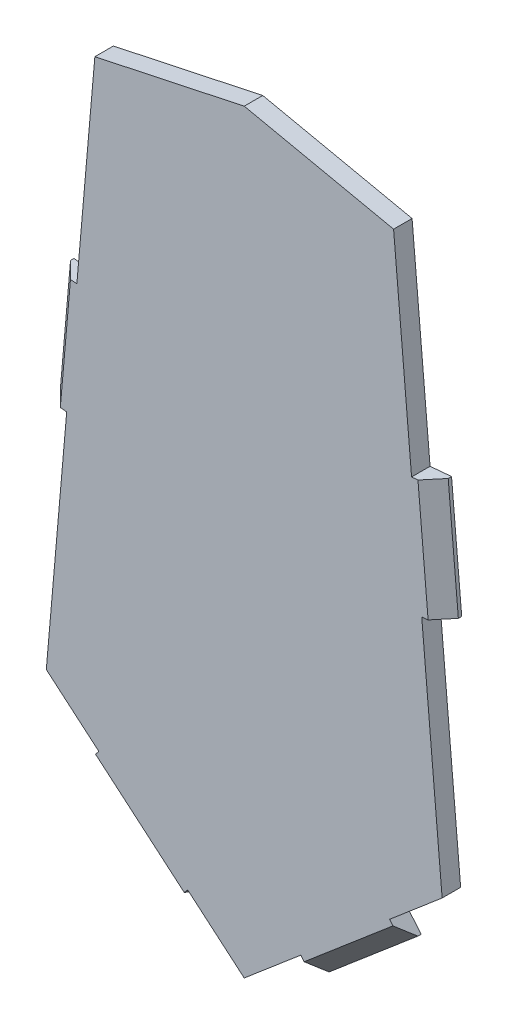
ISO-10303-21;
HEADER;
FILE_DESCRIPTION(('STEP AP214'),'2;1');
FILE_NAME('part.step','',(''),(''),'','','');
FILE_SCHEMA(('AUTOMOTIVE_DESIGN { 1 0 10303 214 1 1 1 1 }'));
ENDSEC;
DATA;
#1=APPLICATION_CONTEXT('core data for automotive mechanical design processes');
#2=APPLICATION_PROTOCOL_DEFINITION('international standard','automotive_design',2000,#1);
#3=PRODUCT_CONTEXT('',#1,'mechanical');
#4=PRODUCT('Part','Part','',(#3));
#5=PRODUCT_RELATED_PRODUCT_CATEGORY('part','',(#4));
#6=PRODUCT_DEFINITION_FORMATION('','',#4);
#7=PRODUCT_DEFINITION_CONTEXT('part definition',#1,'design');
#8=PRODUCT_DEFINITION('design','',#6,#7);
#9=PRODUCT_DEFINITION_SHAPE('','',#8);
#10=(LENGTH_UNIT() NAMED_UNIT(*) SI_UNIT(.MILLI.,.METRE.));
#11=(NAMED_UNIT(*) PLANE_ANGLE_UNIT() SI_UNIT($,.RADIAN.));
#12=(NAMED_UNIT(*) SI_UNIT($,.STERADIAN.) SOLID_ANGLE_UNIT());
#13=UNCERTAINTY_MEASURE_WITH_UNIT(LENGTH_MEASURE(1.E-05),#10,'distance_accuracy_value','');
#14=(GEOMETRIC_REPRESENTATION_CONTEXT(3) GLOBAL_UNCERTAINTY_ASSIGNED_CONTEXT((#13)) GLOBAL_UNIT_ASSIGNED_CONTEXT((#10,
#11,#12)) REPRESENTATION_CONTEXT('',''));
#15=CARTESIAN_POINT('',(0.,0.,0.));
#16=DIRECTION('',(0.,0.,1.));
#17=DIRECTION('',(1.,0.,0.));
#18=AXIS2_PLACEMENT_3D('',#15,#16,#17);
#19=CARTESIAN_POINT('',(30.5992695588796,2.67708919857576,3.175));
#20=DIRECTION('',(-0.996194698091746,-0.0871557427476548,0.));
#21=DIRECTION('',(0.0871557427476548,-0.996194698091746,0.));
#22=AXIS2_PLACEMENT_3D('',#19,#20,#21);
#23=PLANE('',#22);
#24=DIRECTION('',(-0.0871557427476548,0.996194698091746,0.));
#25=VECTOR('',#24,1.);
#26=CARTESIAN_POINT('',(30.5992695588796,2.67708919857576,0.));
#27=LINE('',#26,#25);
#28=CARTESIAN_POINT('',(33.9676308380893,-35.8234563973893,0.));
#29=VERTEX_POINT('',#28);
#30=CARTESIAN_POINT('',(30.4648415370611,4.21360851891802,0.));
#31=VERTEX_POINT('',#30);
#32=EDGE_CURVE('E249',#29,#31,#27,.T.);
#33=ORIENTED_EDGE('',*,*,#32,.T.);
#34=DIRECTION('',(0.,0.,-1.));
#35=VECTOR('',#34,1.);
#36=CARTESIAN_POINT('',(30.4648415370611,4.21360851891802,3.175));
#37=LINE('',#36,#35);
#38=CARTESIAN_POINT('',(30.4648415370611,4.21360851891802,3.175));
#39=VERTEX_POINT('',#38);
#40=EDGE_CURVE('E227',#39,#31,#37,.T.);
#41=ORIENTED_EDGE('',*,*,#40,.F.);
#42=DIRECTION('',(-0.0871557427476548,0.996194698091746,0.));
#43=VECTOR('',#42,1.);
#44=CARTESIAN_POINT('',(30.5992695588796,2.67708919857576,3.175));
#45=LINE('',#44,#43);
#46=CARTESIAN_POINT('',(33.9676308380893,-35.8234563973893,3.175));
#47=VERTEX_POINT('',#46);
#48=EDGE_CURVE('E234',#47,#39,#45,.T.);
#49=ORIENTED_EDGE('',*,*,#48,.F.);
#50=DIRECTION('',(0.,0.,-1.));
#51=VECTOR('',#50,1.);
#52=CARTESIAN_POINT('',(33.9676308380893,-35.8234563973893,3.175));
#53=LINE('',#52,#51);
#54=EDGE_CURVE('E343',#47,#29,#53,.T.);
#55=ORIENTED_EDGE('',*,*,#54,.T.);
#56=EDGE_LOOP('',(#33,#41,#49,#55));
#57=FACE_BOUND('',#56,.T.);
#58=ADVANCED_FACE('F49',(#57),#23,.F.);
#59=CARTESIAN_POINT('',(-0.1344280218185,1.53651932034224,3.175));
#60=DIRECTION('',(0.0871557427476553,-0.996194698091746,0.));
#61=DIRECTION('',(0.996194698091746,0.0871557427476553,0.));
#62=AXIS2_PLACEMENT_3D('',#59,#60,#61);
#63=PLANE('',#62);
#64=DIRECTION('',(0.,0.,-1.));
#65=VECTOR('',#64,1.);
#66=CARTESIAN_POINT('',(34.1507619200005,4.53608476708434,3.175));
#67=LINE('',#66,#65);
#68=CARTESIAN_POINT('',(34.1507619200005,4.53608476708434,0.57500000000001));
#69=VERTEX_POINT('',#68);
#70=CARTESIAN_POINT('',(34.1507619200005,4.53608476708434,0.));
#71=VERTEX_POINT('',#70);
#72=EDGE_CURVE('E253',#69,#71,#67,.T.);
#73=ORIENTED_EDGE('',*,*,#72,.F.);
#74=DIRECTION('',(0.70441602640276,0.0616284167162174,-0.707106781186546));
#75=VECTOR('',#74,1.);
#76=CARTESIAN_POINT('',(15.7131138415717,2.92299957814134,19.0830768987698));
#77=LINE('',#76,#75);
#78=CARTESIAN_POINT('',(31.560655704962,4.30947983594044,3.175));
#79=VERTEX_POINT('',#78);
#80=EDGE_CURVE('E229',#69,#79,#77,.F.);
#81=ORIENTED_EDGE('',*,*,#80,.T.);
#82=DIRECTION('',(-0.996194698091746,-0.0871557427476553,0.));
#83=VECTOR('',#82,1.);
#84=CARTESIAN_POINT('',(-0.1344280218185,1.53651932034224,3.175));
#85=LINE('',#84,#83);
#86=EDGE_CURVE('E221',#79,#39,#85,.T.);
#87=ORIENTED_EDGE('',*,*,#86,.T.);
#88=ORIENTED_EDGE('',*,*,#40,.T.);
#89=DIRECTION('',(-0.996194698091746,-0.0871557427476553,0.));
#90=VECTOR('',#89,1.);
#91=CARTESIAN_POINT('',(-0.1344280218185,1.53651932034224,0.));
#92=LINE('',#91,#90);
#93=EDGE_CURVE('E416',#71,#31,#92,.T.);
#94=ORIENTED_EDGE('',*,*,#93,.F.);
#95=EDGE_LOOP('',(#73,#81,#87,#88,#94));
#96=FACE_BOUND('',#95,.T.);
#97=ADVANCED_FACE('F224',(#96),#63,.T.);
#98=CARTESIAN_POINT('',(34.285189941819,2.99956544674209,3.175));
#99=DIRECTION('',(0.996194698091746,0.0871557427476549,0.));
#100=DIRECTION('',(-0.0871557427476549,0.996194698091746,0.));
#101=AXIS2_PLACEMENT_3D('',#98,#99,#100);
#102=PLANE('',#101);
#103=DIRECTION('',(0.,0.,-1.));
#104=VECTOR('',#103,1.);
#105=CARTESIAN_POINT('',(32.4076470650474,24.4599787289193,3.175));
#106=LINE('',#105,#104);
#107=CARTESIAN_POINT('',(32.4076470650474,24.4599787289193,0.57500000000001));
#108=VERTEX_POINT('',#107);
#109=CARTESIAN_POINT('',(32.4076470650474,24.4599787289193,0.));
#110=VERTEX_POINT('',#109);
#111=EDGE_CURVE('E260',#108,#110,#106,.T.);
#112=ORIENTED_EDGE('',*,*,#111,.F.);
#113=DIRECTION('',(0.0871557427476549,-0.996194698091746,0.));
#114=VECTOR('',#113,1.);
#115=CARTESIAN_POINT('',(34.285189941819,2.99956544674209,0.57500000000001));
#116=LINE('',#115,#114);
#117=EDGE_CURVE('E283',#108,#69,#116,.T.);
#118=ORIENTED_EDGE('',*,*,#117,.T.);
#119=ORIENTED_EDGE('',*,*,#72,.T.);
#120=DIRECTION('',(0.0871557427476549,-0.996194698091746,0.));
#121=VECTOR('',#120,1.);
#122=CARTESIAN_POINT('',(34.285189941819,2.99956544674209,0.));
#123=LINE('',#122,#121);
#124=EDGE_CURVE('E412',#110,#71,#123,.T.);
#125=ORIENTED_EDGE('',*,*,#124,.F.);
#126=EDGE_LOOP('',(#112,#118,#119,#125));
#127=FACE_BOUND('',#126,.T.);
#128=ADVANCED_FACE('F413',(#127),#102,.T.);
#129=CARTESIAN_POINT('',(-1.8775428767716,21.4604132821772,3.175));
#130=DIRECTION('',(-0.0871557427476548,0.996194698091746,0.));
#131=DIRECTION('',(-0.996194698091746,-0.0871557427476548,0.));
#132=AXIS2_PLACEMENT_3D('',#129,#130,#131);
#133=PLANE('',#132);
#134=DIRECTION('',(0.996194698091746,0.0871557427476548,0.));
#135=VECTOR('',#134,1.);
#136=CARTESIAN_POINT('',(-1.8775428767716,21.4604132821772,3.175));
#137=LINE('',#136,#135);
#138=CARTESIAN_POINT('',(28.721726682108,24.1375024807529,3.175));
#139=VERTEX_POINT('',#138);
#140=CARTESIAN_POINT('',(29.8175408500089,24.2333737977754,3.175));
#141=VERTEX_POINT('',#140);
#142=EDGE_CURVE('E233',#139,#141,#137,.T.);
#143=ORIENTED_EDGE('',*,*,#142,.T.);
#144=DIRECTION('',(-0.70441602640276,-0.0616284167162171,0.707106781186546));
#145=VECTOR('',#144,1.);
#146=CARTESIAN_POINT('',(13.9699989866186,22.8468935399763,19.0830768987698));
#147=LINE('',#146,#145);
#148=EDGE_CURVE('E289',#141,#108,#147,.F.);
#149=ORIENTED_EDGE('',*,*,#148,.T.);
#150=ORIENTED_EDGE('',*,*,#111,.T.);
#151=DIRECTION('',(0.996194698091746,0.0871557427476548,0.));
#152=VECTOR('',#151,1.);
#153=CARTESIAN_POINT('',(-1.8775428767716,21.4604132821772,0.));
#154=LINE('',#153,#152);
#155=CARTESIAN_POINT('',(28.721726682108,24.1375024807529,0.));
#156=VERTEX_POINT('',#155);
#157=EDGE_CURVE('E407',#156,#110,#154,.T.);
#158=ORIENTED_EDGE('',*,*,#157,.F.);
#159=DIRECTION('',(0.,0.,-1.));
#160=VECTOR('',#159,1.);
#161=CARTESIAN_POINT('',(28.721726682108,24.1375024807529,3.175));
#162=LINE('',#161,#160);
#163=EDGE_CURVE('E397',#139,#156,#162,.T.);
#164=ORIENTED_EDGE('',*,*,#163,.F.);
#165=EDGE_LOOP('',(#143,#149,#150,#158,#164));
#166=FACE_BOUND('',#165,.T.);
#167=ADVANCED_FACE('F405',(#166),#133,.T.);
#168=CARTESIAN_POINT('',(25.6343918200051,59.4259014307288,0.));
#169=VERTEX_POINT('',#168);
#170=EDGE_CURVE('E421',#156,#169,#27,.T.);
#171=ORIENTED_EDGE('',*,*,#170,.T.);
#172=DIRECTION('',(0.,0.,-1.));
#173=VECTOR('',#172,1.);
#174=CARTESIAN_POINT('',(25.6343918200051,59.4259014307288,3.175));
#175=LINE('',#174,#173);
#176=CARTESIAN_POINT('',(25.6343918200051,59.4259014307288,3.175));
#177=VERTEX_POINT('',#176);
#178=EDGE_CURVE('E393',#177,#169,#175,.T.);
#179=ORIENTED_EDGE('',*,*,#178,.F.);
#180=EDGE_CURVE('E247',#139,#177,#45,.T.);
#181=ORIENTED_EDGE('',*,*,#180,.F.);
#182=ORIENTED_EDGE('',*,*,#163,.T.);
#183=EDGE_LOOP('',(#171,#179,#181,#182));
#184=FACE_BOUND('',#183,.T.);
#185=ADVANCED_FACE('F528',(#184),#23,.F.);
#186=CARTESIAN_POINT('',(13.2273349663387,62.0698933577639,3.175));
#187=DIRECTION('',(-0.208423819180372,-0.978038604349679,0.));
#188=DIRECTION('',(0.978038604349679,-0.208423819180372,0.));
#189=AXIS2_PLACEMENT_3D('',#186,#187,#188);
#190=PLANE('',#189);
#191=DIRECTION('',(-0.978038604349679,0.208423819180372,0.));
#192=VECTOR('',#191,1.);
#193=CARTESIAN_POINT('',(13.2273349663387,62.0698933577639,0.));
#194=LINE('',#193,#192);
#195=CARTESIAN_POINT('',(0.,64.8886897314464,0.));
#196=VERTEX_POINT('',#195);
#197=EDGE_CURVE('E425',#169,#196,#194,.T.);
#198=ORIENTED_EDGE('',*,*,#197,.T.);
#199=DIRECTION('',(0.,0.,-1.));
#200=VECTOR('',#199,1.);
#201=CARTESIAN_POINT('',(0.,64.8886897314464,3.175));
#202=LINE('',#201,#200);
#203=CARTESIAN_POINT('',(0.,64.8886897314464,3.175));
#204=VERTEX_POINT('',#203);
#205=EDGE_CURVE('E389',#204,#196,#202,.T.);
#206=ORIENTED_EDGE('',*,*,#205,.F.);
#207=DIRECTION('',(-0.978038604349679,0.208423819180372,0.));
#208=VECTOR('',#207,1.);
#209=CARTESIAN_POINT('',(13.2273349663387,62.0698933577639,3.175));
#210=LINE('',#209,#208);
#211=EDGE_CURVE('E514',#177,#204,#210,.T.);
#212=ORIENTED_EDGE('',*,*,#211,.F.);
#213=ORIENTED_EDGE('',*,*,#178,.T.);
#214=EDGE_LOOP('',(#198,#206,#212,#213));
#215=FACE_BOUND('',#214,.T.);
#216=ADVANCED_FACE('F530',(#215),#190,.F.);
#217=CARTESIAN_POINT('',(-13.2273349663387,62.0698933577639,3.175));
#218=DIRECTION('',(0.208423819180372,-0.978038604349679,0.));
#219=DIRECTION('',(0.978038604349679,0.208423819180372,0.));
#220=AXIS2_PLACEMENT_3D('',#217,#218,#219);
#221=PLANE('',#220);
#222=DIRECTION('',(-0.978038604349679,-0.208423819180372,0.));
#223=VECTOR('',#222,1.);
#224=CARTESIAN_POINT('',(-13.2273349663387,62.0698933577639,0.));
#225=LINE('',#224,#223);
#226=CARTESIAN_POINT('',(-25.6343918200051,59.4259014307288,0.));
#227=VERTEX_POINT('',#226);
#228=EDGE_CURVE('E431',#196,#227,#225,.T.);
#229=ORIENTED_EDGE('',*,*,#228,.T.);
#230=DIRECTION('',(0.,0.,-1.));
#231=VECTOR('',#230,1.);
#232=CARTESIAN_POINT('',(-25.6343918200051,59.4259014307288,3.175));
#233=LINE('',#232,#231);
#234=CARTESIAN_POINT('',(-25.6343918200051,59.4259014307288,3.175));
#235=VERTEX_POINT('',#234);
#236=EDGE_CURVE('E385',#235,#227,#233,.T.);
#237=ORIENTED_EDGE('',*,*,#236,.F.);
#238=DIRECTION('',(-0.978038604349679,-0.208423819180372,0.));
#239=VECTOR('',#238,1.);
#240=CARTESIAN_POINT('',(-13.2273349663387,62.0698933577639,3.175));
#241=LINE('',#240,#239);
#242=EDGE_CURVE('E509',#204,#235,#241,.T.);
#243=ORIENTED_EDGE('',*,*,#242,.F.);
#244=ORIENTED_EDGE('',*,*,#205,.T.);
#245=EDGE_LOOP('',(#229,#237,#243,#244));
#246=FACE_BOUND('',#245,.T.);
#247=ADVANCED_FACE('F533',(#246),#221,.F.);
#248=CARTESIAN_POINT('',(-30.5992695588795,2.67708919857573,3.175));
#249=DIRECTION('',(0.996194698091746,-0.0871557427476539,0.));
#250=DIRECTION('',(0.0871557427476539,0.996194698091746,0.));
#251=AXIS2_PLACEMENT_3D('',#248,#249,#250);
#252=PLANE('',#251);
#253=DIRECTION('',(-0.0871557427476539,-0.996194698091746,0.));
#254=VECTOR('',#253,1.);
#255=CARTESIAN_POINT('',(-30.5992695588795,2.67708919857573,0.));
#256=LINE('',#255,#254);
#257=CARTESIAN_POINT('',(-28.7217266821079,24.1375024807529,0.));
#258=VERTEX_POINT('',#257);
#259=EDGE_CURVE('E434',#227,#258,#256,.T.);
#260=ORIENTED_EDGE('',*,*,#259,.T.);
#261=DIRECTION('',(0.,0.,-1.));
#262=VECTOR('',#261,1.);
#263=CARTESIAN_POINT('',(-28.7217266821079,24.1375024807529,3.175));
#264=LINE('',#263,#262);
#265=CARTESIAN_POINT('',(-28.7217266821079,24.1375024807529,3.175));
#266=VERTEX_POINT('',#265);
#267=EDGE_CURVE('E381',#266,#258,#264,.T.);
#268=ORIENTED_EDGE('',*,*,#267,.F.);
#269=DIRECTION('',(-0.0871557427476539,-0.996194698091746,0.));
#270=VECTOR('',#269,1.);
#271=CARTESIAN_POINT('',(-30.5992695588795,2.67708919857573,3.175));
#272=LINE('',#271,#270);
#273=EDGE_CURVE('E501',#235,#266,#272,.T.);
#274=ORIENTED_EDGE('',*,*,#273,.F.);
#275=ORIENTED_EDGE('',*,*,#236,.T.);
#276=EDGE_LOOP('',(#260,#268,#274,#275));
#277=FACE_BOUND('',#276,.T.);
#278=ADVANCED_FACE('F536',(#277),#252,.F.);
#279=CARTESIAN_POINT('',(1.87754287677156,21.4604132821772,3.175));
#280=DIRECTION('',(-0.087155742747653,-0.996194698091746,0.));
#281=DIRECTION('',(0.996194698091746,-0.087155742747653,0.));
#282=AXIS2_PLACEMENT_3D('',#279,#280,#281);
#283=PLANE('',#282);
#284=DIRECTION('',(0.,0.,-1.));
#285=VECTOR('',#284,1.);
#286=CARTESIAN_POINT('',(-32.4076470650474,24.4599787289193,3.175));
#287=LINE('',#286,#285);
#288=CARTESIAN_POINT('',(-32.4076470650474,24.4599787289193,0.575000000000022));
#289=VERTEX_POINT('',#288);
#290=CARTESIAN_POINT('',(-32.4076470650474,24.4599787289193,0.));
#291=VERTEX_POINT('',#290);
#292=EDGE_CURVE('E378',#289,#291,#287,.T.);
#293=ORIENTED_EDGE('',*,*,#292,.F.);
#294=DIRECTION('',(0.704416026402759,-0.0616284167162157,0.707106781186548));
#295=VECTOR('',#294,1.);
#296=CARTESIAN_POINT('',(-29.8175408500089,24.2333737977754,3.17499999999999));
#297=LINE('',#296,#295);
#298=CARTESIAN_POINT('',(-29.8175408500089,24.2333737977754,3.175));
#299=VERTEX_POINT('',#298);
#300=EDGE_CURVE('E280',#289,#299,#297,.T.);
#301=ORIENTED_EDGE('',*,*,#300,.T.);
#302=DIRECTION('',(-0.996194698091746,0.087155742747653,0.));
#303=VECTOR('',#302,1.);
#304=CARTESIAN_POINT('',(1.87754287677156,21.4604132821772,3.175));
#305=LINE('',#304,#303);
#306=EDGE_CURVE('E505',#266,#299,#305,.T.);
#307=ORIENTED_EDGE('',*,*,#306,.F.);
#308=ORIENTED_EDGE('',*,*,#267,.T.);
#309=DIRECTION('',(-0.996194698091746,0.087155742747653,0.));
#310=VECTOR('',#309,1.);
#311=CARTESIAN_POINT('',(1.87754287677156,21.4604132821772,0.));
#312=LINE('',#311,#310);
#313=EDGE_CURVE('E437',#258,#291,#312,.T.);
#314=ORIENTED_EDGE('',*,*,#313,.T.);
#315=EDGE_LOOP('',(#293,#301,#307,#308,#314));
#316=FACE_BOUND('',#315,.T.);
#317=ADVANCED_FACE('F541',(#316),#283,.F.);
#318=CARTESIAN_POINT('',(-34.285189941819,2.99956544674203,3.175));
#319=DIRECTION('',(0.996194698091746,-0.0871557427476535,0.));
#320=DIRECTION('',(0.0871557427476535,0.996194698091746,0.));
#321=AXIS2_PLACEMENT_3D('',#318,#319,#320);
#322=PLANE('',#321);
#323=DIRECTION('',(0.,0.,-1.));
#324=VECTOR('',#323,1.);
#325=CARTESIAN_POINT('',(-34.1507619200005,4.53608476708434,3.175));
#326=LINE('',#325,#324);
#327=CARTESIAN_POINT('',(-34.1507619200005,4.53608476708434,0.575000000000022));
#328=VERTEX_POINT('',#327);
#329=CARTESIAN_POINT('',(-34.1507619200005,4.53608476708434,0.));
#330=VERTEX_POINT('',#329);
#331=EDGE_CURVE('E375',#328,#330,#326,.T.);
#332=ORIENTED_EDGE('',*,*,#331,.F.);
#333=DIRECTION('',(0.0871557427476535,0.996194698091746,0.));
#334=VECTOR('',#333,1.);
#335=CARTESIAN_POINT('',(-32.4076470650474,24.4599787289193,0.575000000000022));
#336=LINE('',#335,#334);
#337=EDGE_CURVE('E277',#328,#289,#336,.T.);
#338=ORIENTED_EDGE('',*,*,#337,.T.);
#339=ORIENTED_EDGE('',*,*,#292,.T.);
#340=DIRECTION('',(-0.0871557427476535,-0.996194698091746,0.));
#341=VECTOR('',#340,1.);
#342=CARTESIAN_POINT('',(-34.285189941819,2.99956544674203,0.));
#343=LINE('',#342,#341);
#344=EDGE_CURVE('E442',#291,#330,#343,.T.);
#345=ORIENTED_EDGE('',*,*,#344,.T.);
#346=EDGE_LOOP('',(#332,#338,#339,#345));
#347=FACE_BOUND('',#346,.T.);
#348=ADVANCED_FACE('F553',(#347),#322,.F.);
#349=CARTESIAN_POINT('',(0.134428021818501,1.53651932034229,3.175));
#350=DIRECTION('',(0.087155742747654,0.996194698091746,0.));
#351=DIRECTION('',(-0.996194698091746,0.087155742747654,0.));
#352=AXIS2_PLACEMENT_3D('',#349,#350,#351);
#353=PLANE('',#352);
#354=DIRECTION('',(0.996194698091746,-0.087155742747654,0.));
#355=VECTOR('',#354,1.);
#356=CARTESIAN_POINT('',(0.134428021818501,1.53651932034229,3.175));
#357=LINE('',#356,#355);
#358=CARTESIAN_POINT('',(-31.560655704962,4.30947983594044,3.175));
#359=VERTEX_POINT('',#358);
#360=CARTESIAN_POINT('',(-30.464841537061,4.21360851891802,3.175));
#361=VERTEX_POINT('',#360);
#362=EDGE_CURVE('E499',#359,#361,#357,.T.);
#363=ORIENTED_EDGE('',*,*,#362,.F.);
#364=DIRECTION('',(-0.704416026402759,0.0616284167162164,-0.707106781186548));
#365=VECTOR('',#364,1.);
#366=CARTESIAN_POINT('',(-31.560655704962,4.30947983594044,3.175));
#367=LINE('',#366,#365);
#368=EDGE_CURVE('E274',#359,#328,#367,.T.);
#369=ORIENTED_EDGE('',*,*,#368,.T.);
#370=ORIENTED_EDGE('',*,*,#331,.T.);
#371=DIRECTION('',(0.996194698091746,-0.087155742747654,0.));
#372=VECTOR('',#371,1.);
#373=CARTESIAN_POINT('',(0.134428021818501,1.53651932034229,0.));
#374=LINE('',#373,#372);
#375=CARTESIAN_POINT('',(-30.464841537061,4.21360851891802,0.));
#376=VERTEX_POINT('',#375);
#377=EDGE_CURVE('E446',#330,#376,#374,.T.);
#378=ORIENTED_EDGE('',*,*,#377,.T.);
#379=DIRECTION('',(0.,0.,-1.));
#380=VECTOR('',#379,1.);
#381=CARTESIAN_POINT('',(-30.464841537061,4.21360851891802,3.175));
#382=LINE('',#381,#380);
#383=EDGE_CURVE('E371',#361,#376,#382,.T.);
#384=ORIENTED_EDGE('',*,*,#383,.F.);
#385=EDGE_LOOP('',(#363,#369,#370,#378,#384));
#386=FACE_BOUND('',#385,.T.);
#387=ADVANCED_FACE('F550',(#386),#353,.F.);
#388=CARTESIAN_POINT('',(-33.9676308380892,-35.8234563973893,0.));
#389=VERTEX_POINT('',#388);
#390=EDGE_CURVE('E438',#376,#389,#256,.T.);
#391=ORIENTED_EDGE('',*,*,#390,.T.);
#392=DIRECTION('',(0.,0.,-1.));
#393=VECTOR('',#392,1.);
#394=CARTESIAN_POINT('',(-33.9676308380892,-35.8234563973893,3.175));
#395=LINE('',#394,#393);
#396=CARTESIAN_POINT('',(-33.9676308380892,-35.8234563973893,3.175));
#397=VERTEX_POINT('',#396);
#398=EDGE_CURVE('E367',#397,#389,#395,.T.);
#399=ORIENTED_EDGE('',*,*,#398,.F.);
#400=EDGE_CURVE('E493',#361,#397,#272,.T.);
#401=ORIENTED_EDGE('',*,*,#400,.F.);
#402=ORIENTED_EDGE('',*,*,#383,.T.);
#403=EDGE_LOOP('',(#391,#399,#401,#402));
#404=FACE_BOUND('',#403,.T.);
#405=ADVANCED_FACE('F559',(#404),#252,.F.);
#406=CARTESIAN_POINT('',(-31.922317355983,-37.5616939272189,3.175));
#407=DIRECTION('',(0.647588089129566,0.761990594966577,0.));
#408=DIRECTION('',(-0.761990594966577,0.647588089129566,0.));
#409=AXIS2_PLACEMENT_3D('',#406,#407,#408);
#410=PLANE('',#409);
#411=DIRECTION('',(0.761990594966577,-0.647588089129566,0.));
#412=VECTOR('',#411,1.);
#413=CARTESIAN_POINT('',(-31.922317355983,-37.5616939272189,0.));
#414=LINE('',#413,#412);
#415=CARTESIAN_POINT('',(-24.9380422877353,-43.4973752535746,0.));
#416=VERTEX_POINT('',#415);
#417=EDGE_CURVE('E449',#389,#416,#414,.T.);
#418=ORIENTED_EDGE('',*,*,#417,.T.);
#419=DIRECTION('',(0.,0.,-1.));
#420=VECTOR('',#419,1.);
#421=CARTESIAN_POINT('',(-24.9380422877353,-43.4973752535746,3.175));
#422=LINE('',#421,#420);
#423=CARTESIAN_POINT('',(-24.9380422877353,-43.4973752535746,3.175));
#424=VERTEX_POINT('',#423);
#425=EDGE_CURVE('E363',#424,#416,#422,.T.);
#426=ORIENTED_EDGE('',*,*,#425,.F.);
#427=DIRECTION('',(0.761990594966577,-0.647588089129566,0.));
#428=VECTOR('',#427,1.);
#429=CARTESIAN_POINT('',(-31.922317355983,-37.5616939272189,3.175));
#430=LINE('',#429,#428);
#431=EDGE_CURVE('E485',#397,#424,#430,.T.);
#432=ORIENTED_EDGE('',*,*,#431,.F.);
#433=ORIENTED_EDGE('',*,*,#398,.T.);
#434=EDGE_LOOP('',(#418,#426,#432,#433));
#435=FACE_BOUND('',#434,.T.);
#436=ADVANCED_FACE('F561',(#435),#410,.F.);
#437=CARTESIAN_POINT('',(6.98427506824771,-5.93568132635574,3.175));
#438=DIRECTION('',(0.761990594966576,-0.647588089129567,0.));
#439=DIRECTION('',(0.647588089129567,0.761990594966576,0.));
#440=AXIS2_PLACEMENT_3D('',#437,#438,#439);
#441=PLANE('',#440);
#442=DIRECTION('',(0.,0.,-1.));
#443=VECTOR('',#442,1.);
#444=CARTESIAN_POINT('',(-27.2046005996888,-46.1643423359576,3.175));
#445=LINE('',#444,#443);
#446=CARTESIAN_POINT('',(-27.2046005996888,-46.1643423359576,0.574999999999994));
#447=VERTEX_POINT('',#446);
#448=CARTESIAN_POINT('',(-27.2046005996888,-46.1643423359576,0.));
#449=VERTEX_POINT('',#448);
#450=EDGE_CURVE('E360',#447,#449,#445,.T.);
#451=ORIENTED_EDGE('',*,*,#450,.F.);
#452=DIRECTION('',(0.457913929239153,0.538808716901236,0.70710678118655));
#453=VECTOR('',#452,1.);
#454=CARTESIAN_POINT('',(-25.5208715679519,-44.1831667890446,3.17499999999993));
#455=LINE('',#454,#453);
#456=CARTESIAN_POINT('',(-25.5208715679519,-44.1831667890445,3.175));
#457=VERTEX_POINT('',#456);
#458=EDGE_CURVE('E11',#447,#457,#455,.T.);
#459=ORIENTED_EDGE('',*,*,#458,.T.);
#460=DIRECTION('',(-0.647588089129567,-0.761990594966576,0.));
#461=VECTOR('',#460,1.);
#462=CARTESIAN_POINT('',(6.98427506824771,-5.93568132635574,3.175));
#463=LINE('',#462,#461);
#464=EDGE_CURVE('E489',#424,#457,#463,.T.);
#465=ORIENTED_EDGE('',*,*,#464,.F.);
#466=ORIENTED_EDGE('',*,*,#425,.T.);
#467=DIRECTION('',(-0.647588089129567,-0.761990594966576,0.));
#468=VECTOR('',#467,1.);
#469=CARTESIAN_POINT('',(6.98427506824771,-5.93568132635574,0.));
#470=LINE('',#469,#468);
#471=EDGE_CURVE('E452',#416,#449,#470,.T.);
#472=ORIENTED_EDGE('',*,*,#471,.T.);
#473=EDGE_LOOP('',(#451,#459,#465,#466,#472));
#474=FACE_BOUND('',#473,.T.);
#475=ADVANCED_FACE('F565',(#474),#441,.F.);
#476=CARTESIAN_POINT('',(-34.1888756679359,-40.2286610096025,3.175));
#477=DIRECTION('',(0.647588089129556,0.761990594966585,0.));
#478=DIRECTION('',(-0.761990594966585,0.647588089129556,0.));
#479=AXIS2_PLACEMENT_3D('',#476,#477,#478);
#480=PLANE('',#479);
#481=DIRECTION('',(0.,0.,-1.));
#482=VECTOR('',#481,1.);
#483=CARTESIAN_POINT('',(-11.964788700357,-59.1161041185487,3.175));
#484=LINE('',#483,#482);
#485=CARTESIAN_POINT('',(-11.964788700357,-59.1161041185487,0.574999999999994));
#486=VERTEX_POINT('',#485);
#487=CARTESIAN_POINT('',(-11.964788700357,-59.1161041185487,0.));
#488=VERTEX_POINT('',#487);
#489=EDGE_CURVE('E357',#486,#488,#484,.T.);
#490=ORIENTED_EDGE('',*,*,#489,.F.);
#491=DIRECTION('',(-0.761990594966585,0.647588089129556,0.));
#492=VECTOR('',#491,1.);
#493=CARTESIAN_POINT('',(-27.2046005996887,-46.1643423359576,0.574999999999994));
#494=LINE('',#493,#492);
#495=EDGE_CURVE('E59',#486,#447,#494,.T.);
#496=ORIENTED_EDGE('',*,*,#495,.T.);
#497=ORIENTED_EDGE('',*,*,#450,.T.);
#498=DIRECTION('',(0.761990594966585,-0.647588089129556,0.));
#499=VECTOR('',#498,1.);
#500=CARTESIAN_POINT('',(-34.1888756679359,-40.2286610096025,0.));
#501=LINE('',#500,#499);
#502=EDGE_CURVE('E457',#449,#488,#501,.T.);
#503=ORIENTED_EDGE('',*,*,#502,.T.);
#504=EDGE_LOOP('',(#490,#496,#497,#503));
#505=FACE_BOUND('',#504,.T.);
#506=ADVANCED_FACE('F652',(#505),#480,.F.);
#507=CARTESIAN_POINT('',(22.2240869675792,-18.887443108947,3.175));
#508=DIRECTION('',(-0.761990594966577,0.647588089129566,0.));
#509=DIRECTION('',(-0.647588089129566,-0.761990594966577,0.));
#510=AXIS2_PLACEMENT_3D('',#507,#508,#509);
#511=PLANE('',#510);
#512=DIRECTION('',(0.647588089129566,0.761990594966577,0.));
#513=VECTOR('',#512,1.);
#514=CARTESIAN_POINT('',(22.2240869675792,-18.887443108947,3.175));
#515=LINE('',#514,#513);
#516=CARTESIAN_POINT('',(-10.2810596686202,-57.1349285716356,3.175));
#517=VERTEX_POINT('',#516);
#518=CARTESIAN_POINT('',(-9.69823038840377,-56.4491370361659,3.175));
#519=VERTEX_POINT('',#518);
#520=EDGE_CURVE('E483',#517,#519,#515,.T.);
#521=ORIENTED_EDGE('',*,*,#520,.F.);
#522=DIRECTION('',(-0.457913929239153,-0.538808716901236,-0.70710678118655));
#523=VECTOR('',#522,1.);
#524=CARTESIAN_POINT('',(-10.2810596686203,-57.1349285716358,3.1749999999998));
#525=LINE('',#524,#523);
#526=EDGE_CURVE('E73',#517,#486,#525,.T.);
#527=ORIENTED_EDGE('',*,*,#526,.T.);
#528=ORIENTED_EDGE('',*,*,#489,.T.);
#529=DIRECTION('',(0.647588089129566,0.761990594966577,0.));
#530=VECTOR('',#529,1.);
#531=CARTESIAN_POINT('',(22.2240869675792,-18.887443108947,0.));
#532=LINE('',#531,#530);
#533=CARTESIAN_POINT('',(-9.69823038840377,-56.4491370361659,0.));
#534=VERTEX_POINT('',#533);
#535=EDGE_CURVE('E461',#488,#534,#532,.T.);
#536=ORIENTED_EDGE('',*,*,#535,.T.);
#537=DIRECTION('',(0.,0.,-1.));
#538=VECTOR('',#537,1.);
#539=CARTESIAN_POINT('',(-9.69823038840377,-56.4491370361659,3.175));
#540=LINE('',#539,#538);
#541=EDGE_CURVE('E353',#519,#534,#540,.T.);
#542=ORIENTED_EDGE('',*,*,#541,.F.);
#543=EDGE_LOOP('',(#521,#527,#528,#536,#542));
#544=FACE_BOUND('',#543,.T.);
#545=ADVANCED_FACE('F635',(#544),#511,.F.);
#546=CARTESIAN_POINT('',(0.,-64.6913102685536,0.));
#547=VERTEX_POINT('',#546);
#548=EDGE_CURVE('E453',#534,#547,#414,.T.);
#549=ORIENTED_EDGE('',*,*,#548,.T.);
#550=DIRECTION('',(0.,0.,-1.));
#551=VECTOR('',#550,1.);
#552=CARTESIAN_POINT('',(0.,-64.6913102685536,3.175));
#553=LINE('',#552,#551);
#554=CARTESIAN_POINT('',(0.,-64.6913102685536,3.175));
#555=VERTEX_POINT('',#554);
#556=EDGE_CURVE('E349',#555,#547,#553,.T.);
#557=ORIENTED_EDGE('',*,*,#556,.F.);
#558=EDGE_CURVE('E481',#519,#555,#430,.T.);
#559=ORIENTED_EDGE('',*,*,#558,.F.);
#560=ORIENTED_EDGE('',*,*,#541,.T.);
#561=EDGE_LOOP('',(#549,#557,#559,#560));
#562=FACE_BOUND('',#561,.T.);
#563=ADVANCED_FACE('F619',(#562),#410,.F.);
#564=CARTESIAN_POINT('',(31.922317355983,-37.561693927219,3.175));
#565=DIRECTION('',(-0.647588089129565,0.761990594966577,0.));
#566=DIRECTION('',(-0.761990594966578,-0.647588089129565,0.));
#567=AXIS2_PLACEMENT_3D('',#564,#565,#566);
#568=PLANE('',#567);
#569=DIRECTION('',(0.761990594966578,0.647588089129565,0.));
#570=VECTOR('',#569,1.);
#571=CARTESIAN_POINT('',(31.922317355983,-37.561693927219,0.));
#572=LINE('',#571,#570);
#573=CARTESIAN_POINT('',(9.69823038840384,-56.4491370361659,0.));
#574=VERTEX_POINT('',#573);
#575=EDGE_CURVE('E464',#547,#574,#572,.T.);
#576=ORIENTED_EDGE('',*,*,#575,.T.);
#577=DIRECTION('',(0.,0.,-1.));
#578=VECTOR('',#577,1.);
#579=CARTESIAN_POINT('',(9.69823038840384,-56.4491370361659,3.175));
#580=LINE('',#579,#578);
#581=CARTESIAN_POINT('',(9.69823038840384,-56.4491370361659,3.175));
#582=VERTEX_POINT('',#581);
#583=EDGE_CURVE('E340',#582,#574,#580,.T.);
#584=ORIENTED_EDGE('',*,*,#583,.F.);
#585=DIRECTION('',(0.761990594966578,0.647588089129565,0.));
#586=VECTOR('',#585,1.);
#587=CARTESIAN_POINT('',(31.922317355983,-37.561693927219,3.175));
#588=LINE('',#587,#586);
#589=EDGE_CURVE('E318',#555,#582,#588,.T.);
#590=ORIENTED_EDGE('',*,*,#589,.F.);
#591=ORIENTED_EDGE('',*,*,#556,.T.);
#592=EDGE_LOOP('',(#576,#584,#590,#591));
#593=FACE_BOUND('',#592,.T.);
#594=ADVANCED_FACE('F624',(#593),#568,.F.);
#595=CARTESIAN_POINT('',(-22.2240869675791,-18.8874431089468,3.175));
#596=DIRECTION('',(0.761990594966578,0.647588089129564,0.));
#597=DIRECTION('',(-0.647588089129564,0.761990594966578,0.));
#598=AXIS2_PLACEMENT_3D('',#595,#596,#597);
#599=PLANE('',#598);
#600=DIRECTION('',(0.,0.,-1.));
#601=VECTOR('',#600,1.);
#602=CARTESIAN_POINT('',(11.9647887003573,-59.1161041185489,3.175));
#603=LINE('',#602,#601);
#604=CARTESIAN_POINT('',(11.9647887003573,-59.1161041185489,0.575000000000019));
#605=VERTEX_POINT('',#604);
#606=CARTESIAN_POINT('',(11.9647887003573,-59.1161041185489,0.));
#607=VERTEX_POINT('',#606);
#608=EDGE_CURVE('E312',#605,#607,#603,.T.);
#609=ORIENTED_EDGE('',*,*,#608,.F.);
#610=DIRECTION('',(-0.457913929239153,0.538808716901239,0.707106781186548));
#611=VECTOR('',#610,1.);
#612=CARTESIAN_POINT('',(10.2810596686204,-57.1349285716358,3.17499999999998));
#613=LINE('',#612,#611);
#614=CARTESIAN_POINT('',(10.2810596686204,-57.1349285716358,3.175));
#615=VERTEX_POINT('',#614);
#616=EDGE_CURVE('E298',#605,#615,#613,.T.);
#617=ORIENTED_EDGE('',*,*,#616,.T.);
#618=DIRECTION('',(0.647588089129564,-0.761990594966578,0.));
#619=VECTOR('',#618,1.);
#620=CARTESIAN_POINT('',(-22.2240869675791,-18.8874431089468,3.175));
#621=LINE('',#620,#619);
#622=EDGE_CURVE('E310',#582,#615,#621,.T.);
#623=ORIENTED_EDGE('',*,*,#622,.F.);
#624=ORIENTED_EDGE('',*,*,#583,.T.);
#625=DIRECTION('',(0.647588089129564,-0.761990594966578,0.));
#626=VECTOR('',#625,1.);
#627=CARTESIAN_POINT('',(-22.2240869675791,-18.8874431089468,0.));
#628=LINE('',#627,#626);
#629=EDGE_CURVE('E467',#574,#607,#628,.T.);
#630=ORIENTED_EDGE('',*,*,#629,.T.);
#631=EDGE_LOOP('',(#609,#617,#623,#624,#630));
#632=FACE_BOUND('',#631,.T.);
#633=ADVANCED_FACE('F308',(#632),#599,.F.);
#634=CARTESIAN_POINT('',(34.1888756679364,-40.2286610096021,3.175));
#635=DIRECTION('',(-0.647588089129563,0.761990594966579,0.));
#636=DIRECTION('',(-0.761990594966579,-0.647588089129563,0.));
#637=AXIS2_PLACEMENT_3D('',#634,#635,#636);
#638=PLANE('',#637);
#639=DIRECTION('',(0.,0.,-1.));
#640=VECTOR('',#639,1.);
#641=CARTESIAN_POINT('',(27.2046005996889,-46.1643423359576,3.175));
#642=LINE('',#641,#640);
#643=CARTESIAN_POINT('',(27.2046005996889,-46.1643423359576,0.575000000000019));
#644=VERTEX_POINT('',#643);
#645=CARTESIAN_POINT('',(27.2046005996889,-46.1643423359576,0.));
#646=VERTEX_POINT('',#645);
#647=EDGE_CURVE('E327',#644,#646,#642,.T.);
#648=ORIENTED_EDGE('',*,*,#647,.F.);
#649=DIRECTION('',(-0.761990594966579,-0.647588089129563,0.));
#650=VECTOR('',#649,1.);
#651=CARTESIAN_POINT('',(11.9647887003573,-59.1161041185489,0.575000000000019));
#652=LINE('',#651,#650);
#653=EDGE_CURVE('E295',#644,#605,#652,.T.);
#654=ORIENTED_EDGE('',*,*,#653,.T.);
#655=ORIENTED_EDGE('',*,*,#608,.T.);
#656=DIRECTION('',(0.761990594966579,0.647588089129563,0.));
#657=VECTOR('',#656,1.);
#658=CARTESIAN_POINT('',(34.1888756679364,-40.2286610096021,0.));
#659=LINE('',#658,#657);
#660=EDGE_CURVE('E333',#607,#646,#659,.T.);
#661=ORIENTED_EDGE('',*,*,#660,.T.);
#662=EDGE_LOOP('',(#648,#654,#655,#661));
#663=FACE_BOUND('',#662,.T.);
#664=ADVANCED_FACE('F331',(#663),#638,.F.);
#665=CARTESIAN_POINT('',(-6.98427506824757,-5.9356813263556,3.175));
#666=DIRECTION('',(-0.761990594966577,-0.647588089129565,0.));
#667=DIRECTION('',(0.647588089129565,-0.761990594966578,0.));
#668=AXIS2_PLACEMENT_3D('',#665,#666,#667);
#669=PLANE('',#668);
#670=DIRECTION('',(-0.647588089129565,0.761990594966577,0.));
#671=VECTOR('',#670,1.);
#672=CARTESIAN_POINT('',(-6.98427506824757,-5.9356813263556,3.175));
#673=LINE('',#672,#671);
#674=CARTESIAN_POINT('',(25.520871567952,-44.1831667890446,3.175));
#675=VERTEX_POINT('',#674);
#676=CARTESIAN_POINT('',(24.9380422877354,-43.4973752535746,3.175));
#677=VERTEX_POINT('',#676);
#678=EDGE_CURVE('E321',#675,#677,#673,.T.);
#679=ORIENTED_EDGE('',*,*,#678,.F.);
#680=DIRECTION('',(0.457913929239154,-0.538808716901239,-0.707106781186548));
#681=VECTOR('',#680,1.);
#682=CARTESIAN_POINT('',(25.520871567952,-44.1831667890446,3.17499999999999));
#683=LINE('',#682,#681);
#684=EDGE_CURVE('E292',#675,#644,#683,.T.);
#685=ORIENTED_EDGE('',*,*,#684,.T.);
#686=ORIENTED_EDGE('',*,*,#647,.T.);
#687=DIRECTION('',(-0.647588089129565,0.761990594966577,0.));
#688=VECTOR('',#687,1.);
#689=CARTESIAN_POINT('',(-6.98427506824757,-5.9356813263556,0.));
#690=LINE('',#689,#688);
#691=CARTESIAN_POINT('',(24.9380422877354,-43.4973752535746,0.));
#692=VERTEX_POINT('',#691);
#693=EDGE_CURVE('E472',#646,#692,#690,.T.);
#694=ORIENTED_EDGE('',*,*,#693,.T.);
#695=DIRECTION('',(0.,0.,-1.));
#696=VECTOR('',#695,1.);
#697=CARTESIAN_POINT('',(24.9380422877354,-43.4973752535746,3.175));
#698=LINE('',#697,#696);
#699=EDGE_CURVE('E336',#677,#692,#698,.T.);
#700=ORIENTED_EDGE('',*,*,#699,.F.);
#701=EDGE_LOOP('',(#679,#685,#686,#694,#700));
#702=FACE_BOUND('',#701,.T.);
#703=ADVANCED_FACE('F326',(#702),#669,.F.);
#704=EDGE_CURVE('E245',#692,#29,#572,.T.);
#705=ORIENTED_EDGE('',*,*,#704,.T.);
#706=ORIENTED_EDGE('',*,*,#54,.F.);
#707=EDGE_CURVE('E240',#677,#47,#588,.T.);
#708=ORIENTED_EDGE('',*,*,#707,.F.);
#709=ORIENTED_EDGE('',*,*,#699,.T.);
#710=EDGE_LOOP('',(#705,#706,#708,#709));
#711=FACE_BOUND('',#710,.T.);
#712=ADVANCED_FACE('F628',(#711),#568,.F.);
#713=CARTESIAN_POINT('',(0.,0.,3.175));
#714=DIRECTION('',(0.,0.,1.));
#715=DIRECTION('',(1.,0.,0.));
#716=AXIS2_PLACEMENT_3D('',#713,#714,#715);
#717=PLANE('',#716);
#718=ORIENTED_EDGE('',*,*,#306,.T.);
#719=DIRECTION('',(-0.0871557427476535,-0.996194698091746,0.));
#720=VECTOR('',#719,1.);
#721=CARTESIAN_POINT('',(-31.560655704962,4.30947983594044,3.175));
#722=LINE('',#721,#720);
#723=EDGE_CURVE('E270',#299,#359,#722,.T.);
#724=ORIENTED_EDGE('',*,*,#723,.T.);
#725=ORIENTED_EDGE('',*,*,#362,.T.);
#726=ORIENTED_EDGE('',*,*,#400,.T.);
#727=ORIENTED_EDGE('',*,*,#431,.T.);
#728=ORIENTED_EDGE('',*,*,#464,.T.);
#729=DIRECTION('',(0.761990594966585,-0.647588089129556,0.));
#730=VECTOR('',#729,1.);
#731=CARTESIAN_POINT('',(-10.2810596686202,-57.1349285716356,3.175));
#732=LINE('',#731,#730);
#733=EDGE_CURVE('E252',#457,#517,#732,.T.);
#734=ORIENTED_EDGE('',*,*,#733,.T.);
#735=ORIENTED_EDGE('',*,*,#520,.T.);
#736=ORIENTED_EDGE('',*,*,#558,.T.);
#737=ORIENTED_EDGE('',*,*,#589,.T.);
#738=ORIENTED_EDGE('',*,*,#622,.T.);
#739=DIRECTION('',(0.761990594966579,0.647588089129563,0.));
#740=VECTOR('',#739,1.);
#741=CARTESIAN_POINT('',(25.520871567952,-44.1831667890445,3.175));
#742=LINE('',#741,#740);
#743=EDGE_CURVE('E258',#615,#675,#742,.T.);
#744=ORIENTED_EDGE('',*,*,#743,.T.);
#745=ORIENTED_EDGE('',*,*,#678,.T.);
#746=ORIENTED_EDGE('',*,*,#707,.T.);
#747=ORIENTED_EDGE('',*,*,#48,.T.);
#748=ORIENTED_EDGE('',*,*,#86,.F.);
#749=DIRECTION('',(-0.0871557427476549,0.996194698091746,0.));
#750=VECTOR('',#749,1.);
#751=CARTESIAN_POINT('',(31.6950837267805,2.77296051559818,3.175));
#752=LINE('',#751,#750);
#753=EDGE_CURVE('E267',#79,#141,#752,.T.);
#754=ORIENTED_EDGE('',*,*,#753,.T.);
#755=ORIENTED_EDGE('',*,*,#142,.F.);
#756=ORIENTED_EDGE('',*,*,#180,.T.);
#757=ORIENTED_EDGE('',*,*,#211,.T.);
#758=ORIENTED_EDGE('',*,*,#242,.T.);
#759=ORIENTED_EDGE('',*,*,#273,.T.);
#760=EDGE_LOOP('',(#718,#724,#725,#726,#727,#728,#734,#735,#736,#737,#738,#744,#745,#746,#747,
#748,#754,#755,#756,#757,#758,#759));
#761=FACE_BOUND('',#760,.T.);
#762=ADVANCED_FACE('F238',(#761),#717,.T.);
#763=CARTESIAN_POINT('',(0.,0.,0.));
#764=DIRECTION('',(0.,0.,1.));
#765=DIRECTION('',(1.,0.,0.));
#766=AXIS2_PLACEMENT_3D('',#763,#764,#765);
#767=PLANE('',#766);
#768=ORIENTED_EDGE('',*,*,#32,.F.);
#769=ORIENTED_EDGE('',*,*,#704,.F.);
#770=ORIENTED_EDGE('',*,*,#693,.F.);
#771=ORIENTED_EDGE('',*,*,#660,.F.);
#772=ORIENTED_EDGE('',*,*,#629,.F.);
#773=ORIENTED_EDGE('',*,*,#575,.F.);
#774=ORIENTED_EDGE('',*,*,#548,.F.);
#775=ORIENTED_EDGE('',*,*,#535,.F.);
#776=ORIENTED_EDGE('',*,*,#502,.F.);
#777=ORIENTED_EDGE('',*,*,#471,.F.);
#778=ORIENTED_EDGE('',*,*,#417,.F.);
#779=ORIENTED_EDGE('',*,*,#390,.F.);
#780=ORIENTED_EDGE('',*,*,#377,.F.);
#781=ORIENTED_EDGE('',*,*,#344,.F.);
#782=ORIENTED_EDGE('',*,*,#313,.F.);
#783=ORIENTED_EDGE('',*,*,#259,.F.);
#784=ORIENTED_EDGE('',*,*,#228,.F.);
#785=ORIENTED_EDGE('',*,*,#197,.F.);
#786=ORIENTED_EDGE('',*,*,#170,.F.);
#787=ORIENTED_EDGE('',*,*,#157,.T.);
#788=ORIENTED_EDGE('',*,*,#124,.T.);
#789=ORIENTED_EDGE('',*,*,#93,.T.);
#790=EDGE_LOOP('',(#768,#769,#770,#771,#772,#773,#774,#775,#776,#777,#778,#779,#780,#781,#782,
#783,#784,#785,#786,#787,#788,#789));
#791=FACE_BOUND('',#790,.T.);
#792=ADVANCED_FACE('F419',(#791),#767,.F.);
#793=CARTESIAN_POINT('',(-31.6950837267805,2.77296051559814,3.175));
#794=DIRECTION('',(-0.704416026402759,0.0616284167162161,0.707106781186547));
#795=DIRECTION('',(0.0871557427476535,0.996194698091746,0.));
#796=AXIS2_PLACEMENT_3D('',#793,#794,#795);
#797=PLANE('',#796);
#798=ORIENTED_EDGE('',*,*,#300,.F.);
#799=ORIENTED_EDGE('',*,*,#337,.F.);
#800=ORIENTED_EDGE('',*,*,#368,.F.);
#801=ORIENTED_EDGE('',*,*,#723,.F.);
#802=EDGE_LOOP('',(#798,#799,#800,#801));
#803=FACE_BOUND('',#802,.T.);
#804=ADVANCED_FACE('F546',(#803),#797,.T.);
#805=CARTESIAN_POINT('',(34.285189941819,2.99956544674209,0.57500000000001));
#806=DIRECTION('',(-0.704416026402758,-0.061628416716217,-0.707106781186549));
#807=DIRECTION('',(0.0871557427476549,-0.996194698091746,0.));
#808=AXIS2_PLACEMENT_3D('',#805,#806,#807);
#809=PLANE('',#808);
#810=ORIENTED_EDGE('',*,*,#148,.F.);
#811=ORIENTED_EDGE('',*,*,#753,.F.);
#812=ORIENTED_EDGE('',*,*,#80,.F.);
#813=ORIENTED_EDGE('',*,*,#117,.F.);
#814=EDGE_LOOP('',(#810,#811,#812,#813));
#815=FACE_BOUND('',#814,.T.);
#816=ADVANCED_FACE('F573',(#815),#809,.F.);
#817=CARTESIAN_POINT('',(32.5051466361995,-38.247485462689,3.175));
#818=DIRECTION('',(0.457913929239153,-0.53880871690124,0.707106781186547));
#819=DIRECTION('',(-0.761990594966579,-0.647588089129563,0.));
#820=AXIS2_PLACEMENT_3D('',#817,#818,#819);
#821=PLANE('',#820);
#822=ORIENTED_EDGE('',*,*,#616,.F.);
#823=ORIENTED_EDGE('',*,*,#653,.F.);
#824=ORIENTED_EDGE('',*,*,#684,.F.);
#825=ORIENTED_EDGE('',*,*,#743,.F.);
#826=EDGE_LOOP('',(#822,#823,#824,#825));
#827=FACE_BOUND('',#826,.T.);
#828=ADVANCED_FACE('F323',(#827),#821,.T.);
#829=CARTESIAN_POINT('',(-32.5051466361991,-38.2474854626894,3.175));
#830=DIRECTION('',(-0.457913929239149,-0.538808716901247,0.707106781186545));
#831=DIRECTION('',(-0.761990594966585,0.647588089129556,0.));
#832=AXIS2_PLACEMENT_3D('',#829,#830,#831);
#833=PLANE('',#832);
#834=ORIENTED_EDGE('',*,*,#458,.F.);
#835=ORIENTED_EDGE('',*,*,#495,.F.);
#836=ORIENTED_EDGE('',*,*,#526,.F.);
#837=ORIENTED_EDGE('',*,*,#733,.F.);
#838=EDGE_LOOP('',(#834,#835,#836,#837));
#839=FACE_BOUND('',#838,.T.);
#840=ADVANCED_FACE('F52',(#839),#833,.T.);
#841=CLOSED_SHELL('',(#58,#97,#128,#167,#185,#216,#247,#278,#317,#348,#387,#405,#436,#475,#506,
#545,#563,#594,#633,#664,#703,#712,#762,#792,#804,#816,#828,#840));
#842=MANIFOLD_SOLID_BREP('B2',#841);
#843=ADVANCED_BREP_SHAPE_REPRESENTATION('',(#18,#842),#14);
#844=SHAPE_DEFINITION_REPRESENTATION(#9,#843);
ENDSEC;
END-ISO-10303-21;
